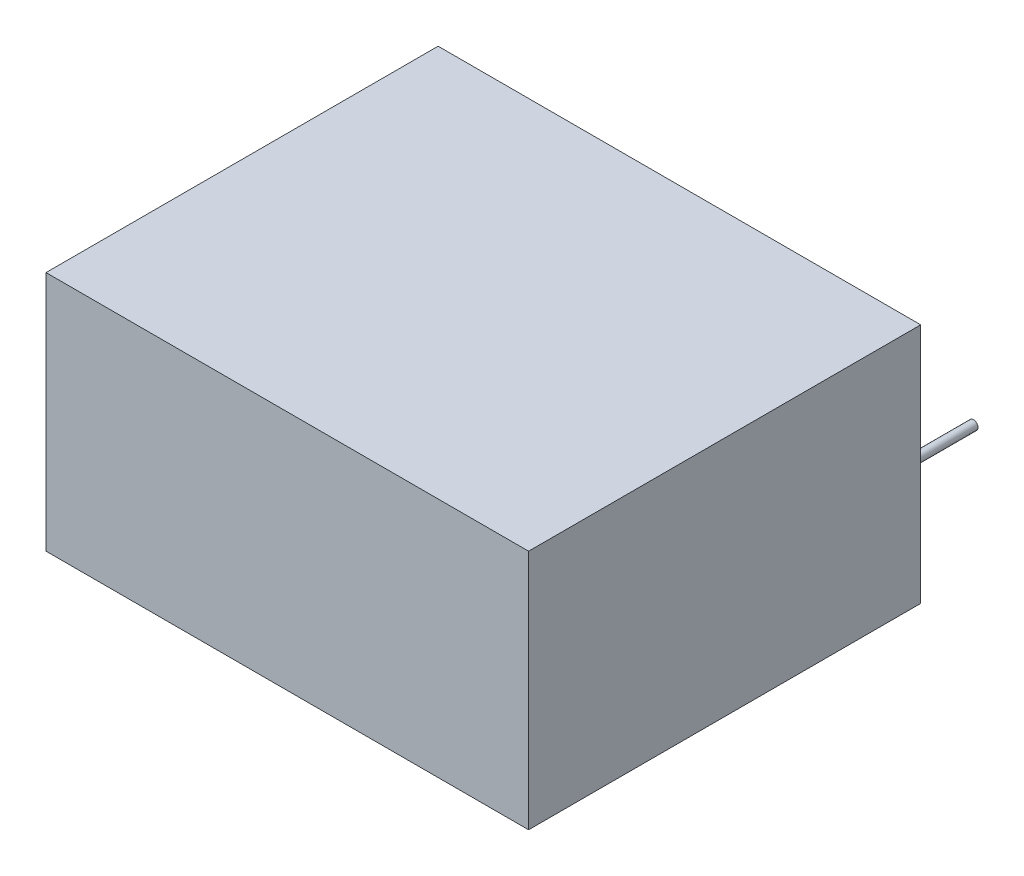
ISO-10303-21;
HEADER;
FILE_DESCRIPTION(('STEP AP214'),'2;1');
FILE_NAME('part.step','',(''),(''),'','','');
FILE_SCHEMA(('AUTOMOTIVE_DESIGN { 1 0 10303 214 1 1 1 1 }'));
ENDSEC;
DATA;
#1=APPLICATION_CONTEXT('core data for automotive mechanical design processes');
#2=APPLICATION_PROTOCOL_DEFINITION('international standard','automotive_design',2000,#1);
#3=PRODUCT_CONTEXT('',#1,'mechanical');
#4=PRODUCT('Part','Part','',(#3));
#5=PRODUCT_RELATED_PRODUCT_CATEGORY('part','',(#4));
#6=PRODUCT_DEFINITION_FORMATION('','',#4);
#7=PRODUCT_DEFINITION_CONTEXT('part definition',#1,'design');
#8=PRODUCT_DEFINITION('design','',#6,#7);
#9=PRODUCT_DEFINITION_SHAPE('','',#8);
#10=(LENGTH_UNIT() NAMED_UNIT(*) SI_UNIT(.MILLI.,.METRE.));
#11=(NAMED_UNIT(*) PLANE_ANGLE_UNIT() SI_UNIT($,.RADIAN.));
#12=(NAMED_UNIT(*) SI_UNIT($,.STERADIAN.) SOLID_ANGLE_UNIT());
#13=UNCERTAINTY_MEASURE_WITH_UNIT(LENGTH_MEASURE(1.E-05),#10,'distance_accuracy_value','');
#14=(GEOMETRIC_REPRESENTATION_CONTEXT(3) GLOBAL_UNCERTAINTY_ASSIGNED_CONTEXT((#13)) GLOBAL_UNIT_ASSIGNED_CONTEXT((#10,
#11,#12)) REPRESENTATION_CONTEXT('',''));
#15=CARTESIAN_POINT('',(0.,0.,0.));
#16=DIRECTION('',(0.,0.,1.));
#17=DIRECTION('',(1.,0.,0.));
#18=AXIS2_PLACEMENT_3D('',#15,#16,#17);
#19=CARTESIAN_POINT('',(-0.5,8.,0.));
#20=DIRECTION('',(0.,0.,1.));
#21=DIRECTION('',(1.,0.,0.));
#22=AXIS2_PLACEMENT_3D('',#19,#20,#21);
#23=PLANE('',#22);
#24=CARTESIAN_POINT('',(0.,0.,0.));
#25=DIRECTION('',(0.,0.,1.));
#26=DIRECTION('',(1.,0.,0.));
#27=AXIS2_PLACEMENT_3D('',#24,#25,#26);
#28=CIRCLE('',#27,0.4);
#29=CARTESIAN_POINT('',(0.4,0.,0.));
#30=VERTEX_POINT('',#29);
#31=EDGE_CURVE('E39',#30,#30,#28,.F.);
#32=ORIENTED_EDGE('',*,*,#31,.F.);
#33=EDGE_LOOP('',(#32));
#34=FACE_BOUND('',#33,.T.);
#35=DIRECTION('',(-1.,0.,0.));
#36=VECTOR('',#35,1.);
#37=CARTESIAN_POINT('',(31.5,8.,0.));
#38=LINE('',#37,#36);
#39=CARTESIAN_POINT('',(31.5,8.,0.));
#40=VERTEX_POINT('',#39);
#41=CARTESIAN_POINT('',(-0.5,8.,0.));
#42=VERTEX_POINT('',#41);
#43=EDGE_CURVE('E98',#40,#42,#38,.T.);
#44=ORIENTED_EDGE('',*,*,#43,.F.);
#45=DIRECTION('',(0.,1.,0.));
#46=VECTOR('',#45,1.);
#47=CARTESIAN_POINT('',(31.5,-8.,0.));
#48=LINE('',#47,#46);
#49=CARTESIAN_POINT('',(31.5,-8.,0.));
#50=VERTEX_POINT('',#49);
#51=EDGE_CURVE('E70',#50,#40,#48,.T.);
#52=ORIENTED_EDGE('',*,*,#51,.F.);
#53=DIRECTION('',(1.,0.,0.));
#54=VECTOR('',#53,1.);
#55=CARTESIAN_POINT('',(-0.499999999999999,-8.,0.));
#56=LINE('',#55,#54);
#57=CARTESIAN_POINT('',(-0.499999999999999,-8.,0.));
#58=VERTEX_POINT('',#57);
#59=EDGE_CURVE('E64',#58,#50,#56,.T.);
#60=ORIENTED_EDGE('',*,*,#59,.F.);
#61=DIRECTION('',(0.,-1.,0.));
#62=VECTOR('',#61,1.);
#63=CARTESIAN_POINT('',(-0.5,8.,0.));
#64=LINE('',#63,#62);
#65=EDGE_CURVE('E88',#42,#58,#64,.T.);
#66=ORIENTED_EDGE('',*,*,#65,.F.);
#67=EDGE_LOOP('',(#44,#52,#60,#66));
#68=FACE_BOUND('',#67,.T.);
#69=CARTESIAN_POINT('',(31.,0.,0.));
#70=DIRECTION('',(0.,0.,1.));
#71=DIRECTION('',(1.,0.,0.));
#72=AXIS2_PLACEMENT_3D('',#69,#70,#71);
#73=CIRCLE('',#72,0.300000000000004);
#74=CARTESIAN_POINT('',(31.3,0.,0.));
#75=VERTEX_POINT('',#74);
#76=EDGE_CURVE('E11',#75,#75,#73,.F.);
#77=ORIENTED_EDGE('',*,*,#76,.F.);
#78=EDGE_LOOP('',(#77));
#79=FACE_BOUND('',#78,.T.);
#80=ADVANCED_FACE('F30',(#34,#68,#79),#23,.F.);
#81=CARTESIAN_POINT('',(31.5,8.,26.));
#82=DIRECTION('',(0.,-1.,0.));
#83=DIRECTION('',(1.,0.,0.));
#84=AXIS2_PLACEMENT_3D('',#81,#82,#83);
#85=PLANE('',#84);
#86=ORIENTED_EDGE('',*,*,#43,.T.);
#87=DIRECTION('',(0.,0.,-1.));
#88=VECTOR('',#87,1.);
#89=CARTESIAN_POINT('',(-0.5,8.,26.));
#90=LINE('',#89,#88);
#91=CARTESIAN_POINT('',(-0.5,8.,26.));
#92=VERTEX_POINT('',#91);
#93=EDGE_CURVE('E89',#92,#42,#90,.T.);
#94=ORIENTED_EDGE('',*,*,#93,.F.);
#95=DIRECTION('',(-1.,0.,0.));
#96=VECTOR('',#95,1.);
#97=CARTESIAN_POINT('',(31.5,8.,26.));
#98=LINE('',#97,#96);
#99=CARTESIAN_POINT('',(31.5,8.,26.));
#100=VERTEX_POINT('',#99);
#101=EDGE_CURVE('E83',#100,#92,#98,.T.);
#102=ORIENTED_EDGE('',*,*,#101,.F.);
#103=DIRECTION('',(0.,0.,-1.));
#104=VECTOR('',#103,1.);
#105=CARTESIAN_POINT('',(31.5,8.,26.));
#106=LINE('',#105,#104);
#107=EDGE_CURVE('E94',#100,#40,#106,.T.);
#108=ORIENTED_EDGE('',*,*,#107,.T.);
#109=EDGE_LOOP('',(#86,#94,#102,#108));
#110=FACE_BOUND('',#109,.T.);
#111=ADVANCED_FACE('F32',(#110),#85,.F.);
#112=CARTESIAN_POINT('',(-0.5,8.,26.));
#113=DIRECTION('',(1.,0.,0.));
#114=DIRECTION('',(0.,1.,0.));
#115=AXIS2_PLACEMENT_3D('',#112,#113,#114);
#116=PLANE('',#115);
#117=ORIENTED_EDGE('',*,*,#65,.T.);
#118=DIRECTION('',(0.,0.,-1.));
#119=VECTOR('',#118,1.);
#120=CARTESIAN_POINT('',(-0.499999999999999,-8.,26.));
#121=LINE('',#120,#119);
#122=CARTESIAN_POINT('',(-0.499999999999999,-8.,26.));
#123=VERTEX_POINT('',#122);
#124=EDGE_CURVE('E86',#123,#58,#121,.T.);
#125=ORIENTED_EDGE('',*,*,#124,.F.);
#126=DIRECTION('',(0.,-1.,0.));
#127=VECTOR('',#126,1.);
#128=CARTESIAN_POINT('',(-0.5,8.,26.));
#129=LINE('',#128,#127);
#130=EDGE_CURVE('E78',#92,#123,#129,.T.);
#131=ORIENTED_EDGE('',*,*,#130,.F.);
#132=ORIENTED_EDGE('',*,*,#93,.T.);
#133=EDGE_LOOP('',(#117,#125,#131,#132));
#134=FACE_BOUND('',#133,.T.);
#135=ADVANCED_FACE('F87',(#134),#116,.F.);
#136=CARTESIAN_POINT('',(-0.499999999999999,-8.,26.));
#137=DIRECTION('',(0.,1.,0.));
#138=DIRECTION('',(0.,0.,1.));
#139=AXIS2_PLACEMENT_3D('',#136,#137,#138);
#140=PLANE('',#139);
#141=ORIENTED_EDGE('',*,*,#59,.T.);
#142=DIRECTION('',(0.,0.,-1.));
#143=VECTOR('',#142,1.);
#144=CARTESIAN_POINT('',(31.5,-8.,26.));
#145=LINE('',#144,#143);
#146=CARTESIAN_POINT('',(31.5,-8.,26.));
#147=VERTEX_POINT('',#146);
#148=EDGE_CURVE('E90',#147,#50,#145,.T.);
#149=ORIENTED_EDGE('',*,*,#148,.F.);
#150=DIRECTION('',(1.,0.,0.));
#151=VECTOR('',#150,1.);
#152=CARTESIAN_POINT('',(-0.499999999999999,-8.,26.));
#153=LINE('',#152,#151);
#154=EDGE_CURVE('E81',#123,#147,#153,.T.);
#155=ORIENTED_EDGE('',*,*,#154,.F.);
#156=ORIENTED_EDGE('',*,*,#124,.T.);
#157=EDGE_LOOP('',(#141,#149,#155,#156));
#158=FACE_BOUND('',#157,.T.);
#159=ADVANCED_FACE('F92',(#158),#140,.F.);
#160=CARTESIAN_POINT('',(31.5,-8.,26.));
#161=DIRECTION('',(-1.,0.,0.));
#162=DIRECTION('',(0.,-1.,0.));
#163=AXIS2_PLACEMENT_3D('',#160,#161,#162);
#164=PLANE('',#163);
#165=ORIENTED_EDGE('',*,*,#51,.T.);
#166=ORIENTED_EDGE('',*,*,#107,.F.);
#167=DIRECTION('',(0.,1.,0.));
#168=VECTOR('',#167,1.);
#169=CARTESIAN_POINT('',(31.5,-8.,26.));
#170=LINE('',#169,#168);
#171=EDGE_CURVE('E47',#147,#100,#170,.T.);
#172=ORIENTED_EDGE('',*,*,#171,.F.);
#173=ORIENTED_EDGE('',*,*,#148,.T.);
#174=EDGE_LOOP('',(#165,#166,#172,#173));
#175=FACE_BOUND('',#174,.T.);
#176=ADVANCED_FACE('F139',(#175),#164,.F.);
#177=CARTESIAN_POINT('',(-0.5,8.,26.));
#178=DIRECTION('',(0.,0.,1.));
#179=DIRECTION('',(1.,0.,0.));
#180=AXIS2_PLACEMENT_3D('',#177,#178,#179);
#181=PLANE('',#180);
#182=ORIENTED_EDGE('',*,*,#101,.T.);
#183=ORIENTED_EDGE('',*,*,#130,.T.);
#184=ORIENTED_EDGE('',*,*,#154,.T.);
#185=ORIENTED_EDGE('',*,*,#171,.T.);
#186=EDGE_LOOP('',(#182,#183,#184,#185));
#187=FACE_BOUND('',#186,.T.);
#188=ADVANCED_FACE('F79',(#187),#181,.T.);
#189=CARTESIAN_POINT('',(0.,0.,-4.));
#190=DIRECTION('',(0.,0.,1.));
#191=DIRECTION('',(1.,0.,0.));
#192=AXIS2_PLACEMENT_3D('',#189,#190,#191);
#193=CYLINDRICAL_SURFACE('',#192,0.4);
#194=CARTESIAN_POINT('',(0.,0.,-4.));
#195=DIRECTION('',(0.,0.,-1.));
#196=DIRECTION('',(-1.,0.,0.));
#197=AXIS2_PLACEMENT_3D('',#194,#195,#196);
#198=CIRCLE('',#197,0.4);
#199=CARTESIAN_POINT('',(-0.4,0.,-4.));
#200=VERTEX_POINT('',#199);
#201=EDGE_CURVE('E101',#200,#200,#198,.T.);
#202=ORIENTED_EDGE('',*,*,#201,.F.);
#203=EDGE_LOOP('',(#202));
#204=FACE_BOUND('',#203,.T.);
#205=ORIENTED_EDGE('',*,*,#31,.T.);
#206=EDGE_LOOP('',(#205));
#207=FACE_BOUND('',#206,.T.);
#208=ADVANCED_FACE('F110',(#204,#207),#193,.T.);
#209=CARTESIAN_POINT('',(0.,0.,-4.));
#210=DIRECTION('',(0.,0.,-1.));
#211=DIRECTION('',(-1.,0.,0.));
#212=AXIS2_PLACEMENT_3D('',#209,#210,#211);
#213=PLANE('',#212);
#214=ORIENTED_EDGE('',*,*,#201,.T.);
#215=EDGE_LOOP('',(#214));
#216=FACE_BOUND('',#215,.T.);
#217=ADVANCED_FACE('F122',(#216),#213,.T.);
#218=CARTESIAN_POINT('',(31.,0.,-4.));
#219=DIRECTION('',(0.,0.,1.));
#220=DIRECTION('',(1.,0.,0.));
#221=AXIS2_PLACEMENT_3D('',#218,#219,#220);
#222=CYLINDRICAL_SURFACE('',#221,0.300000000000004);
#223=CARTESIAN_POINT('',(31.,0.,-4.));
#224=DIRECTION('',(0.,0.,-1.));
#225=DIRECTION('',(1.,0.,0.));
#226=AXIS2_PLACEMENT_3D('',#223,#224,#225);
#227=CIRCLE('',#226,0.300000000000004);
#228=CARTESIAN_POINT('',(31.3,0.,-4.));
#229=VERTEX_POINT('',#228);
#230=EDGE_CURVE('E154',#229,#229,#227,.T.);
#231=ORIENTED_EDGE('',*,*,#230,.F.);
#232=EDGE_LOOP('',(#231));
#233=FACE_BOUND('',#232,.T.);
#234=ORIENTED_EDGE('',*,*,#76,.T.);
#235=EDGE_LOOP('',(#234));
#236=FACE_BOUND('',#235,.T.);
#237=ADVANCED_FACE('F119',(#233,#236),#222,.T.);
#238=CARTESIAN_POINT('',(31.,0.,-4.));
#239=DIRECTION('',(0.,0.,1.));
#240=DIRECTION('',(1.,0.,0.));
#241=AXIS2_PLACEMENT_3D('',#238,#239,#240);
#242=PLANE('',#241);
#243=ORIENTED_EDGE('',*,*,#230,.T.);
#244=EDGE_LOOP('',(#243));
#245=FACE_BOUND('',#244,.T.);
#246=ADVANCED_FACE('F121',(#245),#242,.F.);
#247=CLOSED_SHELL('',(#80,#111,#135,#159,#176,#188,#208,#217,#237,#246));
#248=MANIFOLD_SOLID_BREP('B2',#247);
#249=ADVANCED_BREP_SHAPE_REPRESENTATION('',(#18,#248),#14);
#250=SHAPE_DEFINITION_REPRESENTATION(#9,#249);
ENDSEC;
END-ISO-10303-21;
